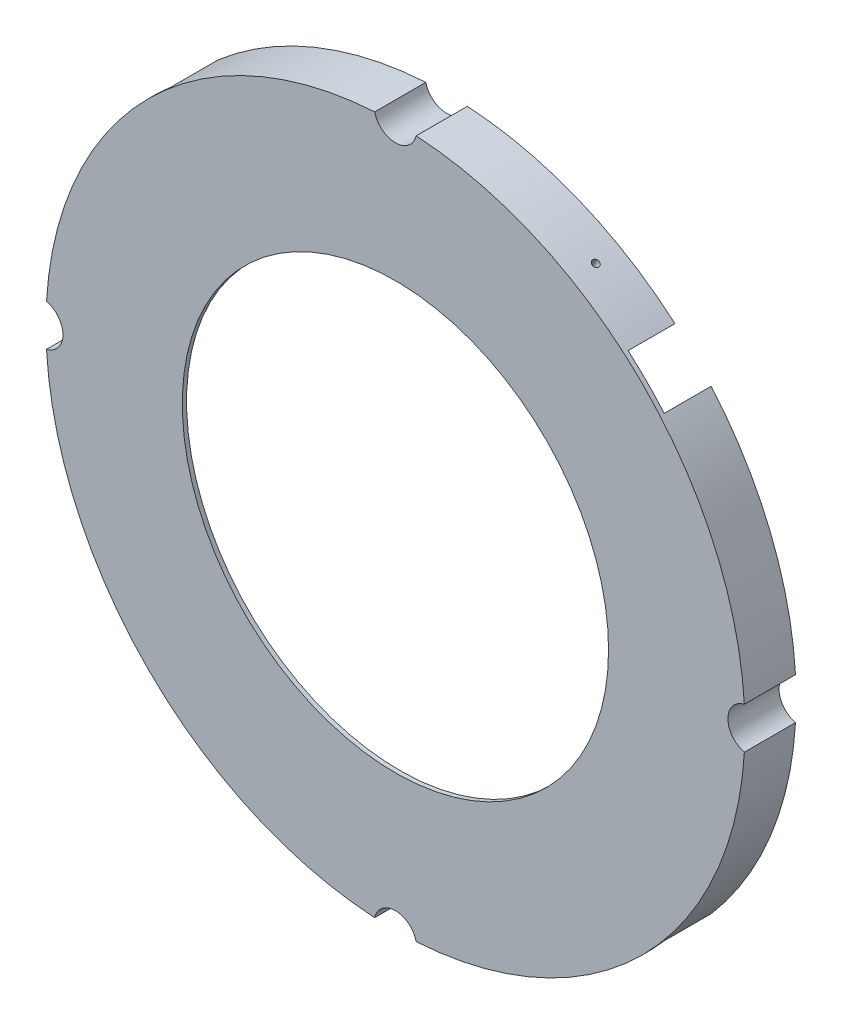
ISO-10303-21;
HEADER;
FILE_DESCRIPTION(('STEP AP214'),'2;1');
FILE_NAME('part.step','',(''),(''),'','','');
FILE_SCHEMA(('AUTOMOTIVE_DESIGN { 1 0 10303 214 1 1 1 1 }'));
ENDSEC;
DATA;
#1=APPLICATION_CONTEXT('core data for automotive mechanical design processes');
#2=APPLICATION_PROTOCOL_DEFINITION('international standard','automotive_design',2000,#1);
#3=PRODUCT_CONTEXT('',#1,'mechanical');
#4=PRODUCT('Part','Part','',(#3));
#5=PRODUCT_RELATED_PRODUCT_CATEGORY('part','',(#4));
#6=PRODUCT_DEFINITION_FORMATION('','',#4);
#7=PRODUCT_DEFINITION_CONTEXT('part definition',#1,'design');
#8=PRODUCT_DEFINITION('design','',#6,#7);
#9=PRODUCT_DEFINITION_SHAPE('','',#8);
#10=(LENGTH_UNIT() NAMED_UNIT(*) SI_UNIT(.MILLI.,.METRE.));
#11=(NAMED_UNIT(*) PLANE_ANGLE_UNIT() SI_UNIT($,.RADIAN.));
#12=(NAMED_UNIT(*) SI_UNIT($,.STERADIAN.) SOLID_ANGLE_UNIT());
#13=UNCERTAINTY_MEASURE_WITH_UNIT(LENGTH_MEASURE(1.E-05),#10,'distance_accuracy_value','');
#14=(GEOMETRIC_REPRESENTATION_CONTEXT(3) GLOBAL_UNCERTAINTY_ASSIGNED_CONTEXT((#13)) GLOBAL_UNIT_ASSIGNED_CONTEXT((#10,
#11,#12)) REPRESENTATION_CONTEXT('',''));
#15=CARTESIAN_POINT('',(0.,0.,0.));
#16=DIRECTION('',(0.,0.,1.));
#17=DIRECTION('',(1.,0.,0.));
#18=AXIS2_PLACEMENT_3D('',#15,#16,#17);
#19=CARTESIAN_POINT('',(0.,0.,-11.));
#20=DIRECTION('',(0.,0.,-1.));
#21=DIRECTION('',(-1.,0.,0.));
#22=AXIS2_PLACEMENT_3D('',#19,#20,#21);
#23=PLANE('',#22);
#24=DIRECTION('',(-0.707106781186541,-0.707106781186554,0.));
#25=VECTOR('',#24,1.);
#26=CARTESIAN_POINT('',(46.5515949457876,38.06631357155,-11.));
#27=LINE('',#26,#25);
#28=CARTESIAN_POINT('',(62.0699698663226,53.5846884920852,-11.));
#29=VERTEX_POINT('',#28);
#30=CARTESIAN_POINT('',(57.1056712472371,48.6203898729996,-11.));
#31=VERTEX_POINT('',#30);
#32=EDGE_CURVE('E368',#29,#31,#27,.T.);
#33=ORIENTED_EDGE('',*,*,#32,.F.);
#34=CARTESIAN_POINT('',(0.,0.,-11.));
#35=DIRECTION('',(0.,0.,-1.));
#36=DIRECTION('',(-1.,0.,0.));
#37=AXIS2_PLACEMENT_3D('',#34,#35,#36);
#38=CIRCLE('',#37,82.);
#39=CARTESIAN_POINT('',(81.855421686747,4.8672312955959,-11.));
#40=VERTEX_POINT('',#39);
#41=EDGE_CURVE('E336',#29,#40,#38,.T.);
#42=ORIENTED_EDGE('',*,*,#41,.T.);
#43=CARTESIAN_POINT('',(83.,-2.8979295112398E-13,-11.));
#44=DIRECTION('',(0.,0.,1.));
#45=DIRECTION('',(0.,-1.,0.));
#46=AXIS2_PLACEMENT_3D('',#43,#44,#45);
#47=CIRCLE('',#46,5.);
#48=CARTESIAN_POINT('',(81.855421686747,-4.86723129559648,-11.));
#49=VERTEX_POINT('',#48);
#50=EDGE_CURVE('E302',#40,#49,#47,.T.);
#51=ORIENTED_EDGE('',*,*,#50,.T.);
#52=CARTESIAN_POINT('',(62.0699698663231,-53.5846884920846,-11.));
#53=VERTEX_POINT('',#52);
#54=EDGE_CURVE('E337',#49,#53,#38,.T.);
#55=ORIENTED_EDGE('',*,*,#54,.T.);
#56=DIRECTION('',(0.707106781186547,-0.707106781186547,0.));
#57=VECTOR('',#56,1.);
#58=CARTESIAN_POINT('',(67.8822509939086,-59.39696961967,-11.));
#59=LINE('',#58,#57);
#60=CARTESIAN_POINT('',(57.1056712472376,-48.620389872999,-11.));
#61=VERTEX_POINT('',#60);
#62=EDGE_CURVE('E222',#61,#53,#59,.T.);
#63=ORIENTED_EDGE('',*,*,#62,.F.);
#64=CARTESIAN_POINT('',(0.,0.,-11.));
#65=DIRECTION('',(0.,0.,-1.));
#66=DIRECTION('',(-1.,0.,0.));
#67=AXIS2_PLACEMENT_3D('',#64,#65,#66);
#68=CIRCLE('',#67,75.);
#69=EDGE_CURVE('E330',#31,#61,#68,.T.);
#70=ORIENTED_EDGE('',*,*,#69,.F.);
#71=EDGE_LOOP('',(#33,#42,#51,#55,#63,#70));
#72=FACE_BOUND('',#71,.T.);
#73=ADVANCED_FACE('F33',(#72),#23,.T.);
#74=CARTESIAN_POINT('',(0.,0.,-11.));
#75=DIRECTION('',(0.,0.,1.));
#76=DIRECTION('',(1.,0.,0.));
#77=AXIS2_PLACEMENT_3D('',#74,#75,#76);
#78=CYLINDRICAL_SURFACE('',#77,75.);
#79=DIRECTION('',(0.,0.,1.));
#80=VECTOR('',#79,1.);
#81=CARTESIAN_POINT('',(57.1056712472371,48.6203898729996,-11.));
#82=LINE('',#81,#80);
#83=CARTESIAN_POINT('',(57.1056712472371,48.6203898729996,0.));
#84=VERTEX_POINT('',#83);
#85=EDGE_CURVE('E45',#31,#84,#82,.T.);
#86=ORIENTED_EDGE('',*,*,#85,.F.);
#87=ORIENTED_EDGE('',*,*,#69,.T.);
#88=DIRECTION('',(0.,0.,1.));
#89=VECTOR('',#88,1.);
#90=CARTESIAN_POINT('',(57.1056712472376,-48.620389872999,-11.));
#91=LINE('',#90,#89);
#92=CARTESIAN_POINT('',(57.1056712472376,-48.620389872999,0.));
#93=VERTEX_POINT('',#92);
#94=EDGE_CURVE('E358',#93,#61,#91,.F.);
#95=ORIENTED_EDGE('',*,*,#94,.F.);
#96=CARTESIAN_POINT('',(0.,0.,0.));
#97=DIRECTION('',(0.,0.,-1.));
#98=DIRECTION('',(-1.,0.,0.));
#99=AXIS2_PLACEMENT_3D('',#96,#97,#98);
#100=CIRCLE('',#99,75.);
#101=EDGE_CURVE('E60',#84,#93,#100,.T.);
#102=ORIENTED_EDGE('',*,*,#101,.F.);
#103=EDGE_LOOP('',(#86,#87,#95,#102));
#104=FACE_BOUND('',#103,.T.);
#105=ADVANCED_FACE('F373',(#104),#78,.F.);
#106=DIRECTION('',(-0.707106781186546,0.707106781186549,0.));
#107=VECTOR('',#106,1.);
#108=CARTESIAN_POINT('',(38.0663135715495,-46.551594945788,-11.));
#109=LINE('',#108,#107);
#110=CARTESIAN_POINT('',(53.5846884920845,-62.0699698663232,-11.));
#111=VERTEX_POINT('',#110);
#112=CARTESIAN_POINT('',(48.620389872999,-57.1056712472376,-11.));
#113=VERTEX_POINT('',#112);
#114=EDGE_CURVE('E220',#111,#113,#109,.T.);
#115=ORIENTED_EDGE('',*,*,#114,.F.);
#116=CARTESIAN_POINT('',(4.86723129559619,-81.855421686747,-11.));
#117=VERTEX_POINT('',#116);
#118=EDGE_CURVE('E403',#111,#117,#38,.T.);
#119=ORIENTED_EDGE('',*,*,#118,.T.);
#120=CARTESIAN_POINT('',(0.,-83.,-11.));
#121=DIRECTION('',(0.,0.,1.));
#122=DIRECTION('',(-1.,0.,0.));
#123=AXIS2_PLACEMENT_3D('',#120,#121,#122);
#124=CIRCLE('',#123,5.);
#125=CARTESIAN_POINT('',(-4.86723129559619,-81.855421686747,-11.));
#126=VERTEX_POINT('',#125);
#127=EDGE_CURVE('E290',#117,#126,#124,.T.);
#128=ORIENTED_EDGE('',*,*,#127,.T.);
#129=CARTESIAN_POINT('',(-53.5846884920843,-62.0699698663233,-11.));
#130=VERTEX_POINT('',#129);
#131=EDGE_CURVE('E404',#126,#130,#38,.T.);
#132=ORIENTED_EDGE('',*,*,#131,.T.);
#133=DIRECTION('',(-0.707106781186545,-0.70710678118655,0.));
#134=VECTOR('',#133,1.);
#135=CARTESIAN_POINT('',(-59.3969696196698,-67.8822509939088,-11.));
#136=LINE('',#135,#134);
#137=CARTESIAN_POINT('',(-48.6203898729988,-57.1056712472378,-11.));
#138=VERTEX_POINT('',#137);
#139=EDGE_CURVE('E242',#138,#130,#136,.T.);
#140=ORIENTED_EDGE('',*,*,#139,.F.);
#141=EDGE_CURVE('E390',#113,#138,#68,.T.);
#142=ORIENTED_EDGE('',*,*,#141,.F.);
#143=EDGE_LOOP('',(#115,#119,#128,#132,#140,#142));
#144=FACE_BOUND('',#143,.T.);
#145=ADVANCED_FACE('F453',(#144),#23,.T.);
#146=DIRECTION('',(0.,0.,1.));
#147=VECTOR('',#146,1.);
#148=CARTESIAN_POINT('',(48.620389872999,-57.1056712472376,-11.));
#149=LINE('',#148,#147);
#150=CARTESIAN_POINT('',(48.620389872999,-57.1056712472376,0.));
#151=VERTEX_POINT('',#150);
#152=EDGE_CURVE('E361',#113,#151,#149,.T.);
#153=ORIENTED_EDGE('',*,*,#152,.F.);
#154=ORIENTED_EDGE('',*,*,#141,.T.);
#155=DIRECTION('',(0.,0.,1.));
#156=VECTOR('',#155,1.);
#157=CARTESIAN_POINT('',(-48.6203898729988,-57.1056712472378,-11.));
#158=LINE('',#157,#156);
#159=CARTESIAN_POINT('',(-48.6203898729988,-57.1056712472378,0.));
#160=VERTEX_POINT('',#159);
#161=EDGE_CURVE('E353',#160,#138,#158,.F.);
#162=ORIENTED_EDGE('',*,*,#161,.F.);
#163=EDGE_CURVE('E374',#151,#160,#100,.T.);
#164=ORIENTED_EDGE('',*,*,#163,.F.);
#165=EDGE_LOOP('',(#153,#154,#162,#164));
#166=FACE_BOUND('',#165,.T.);
#167=ADVANCED_FACE('F458',(#166),#78,.F.);
#168=DIRECTION('',(0.707106781186546,0.707106781186549,0.));
#169=VECTOR('',#168,1.);
#170=CARTESIAN_POINT('',(-46.5515949457879,-38.0663135715496,-11.));
#171=LINE('',#170,#169);
#172=CARTESIAN_POINT('',(-62.069969866323,-53.5846884920848,-11.));
#173=VERTEX_POINT('',#172);
#174=CARTESIAN_POINT('',(-57.1056712472374,-48.6203898729992,-11.));
#175=VERTEX_POINT('',#174);
#176=EDGE_CURVE('E241',#173,#175,#171,.T.);
#177=ORIENTED_EDGE('',*,*,#176,.F.);
#178=CARTESIAN_POINT('',(-81.8554216867471,-4.86723129559533,-11.));
#179=VERTEX_POINT('',#178);
#180=EDGE_CURVE('E405',#173,#179,#38,.T.);
#181=ORIENTED_EDGE('',*,*,#180,.T.);
#182=CARTESIAN_POINT('',(-83.,8.6937885337194E-13,-11.));
#183=DIRECTION('',(0.,0.,1.));
#184=DIRECTION('',(0.,1.,0.));
#185=AXIS2_PLACEMENT_3D('',#182,#183,#184);
#186=CIRCLE('',#185,5.);
#187=CARTESIAN_POINT('',(-81.8554216867469,4.86723129559705,-11.));
#188=VERTEX_POINT('',#187);
#189=EDGE_CURVE('E279',#179,#188,#186,.T.);
#190=ORIENTED_EDGE('',*,*,#189,.T.);
#191=CARTESIAN_POINT('',(-62.0699698663231,53.5846884920846,-11.));
#192=VERTEX_POINT('',#191);
#193=EDGE_CURVE('E407',#188,#192,#38,.T.);
#194=ORIENTED_EDGE('',*,*,#193,.T.);
#195=DIRECTION('',(-0.707106781186547,0.707106781186547,0.));
#196=VECTOR('',#195,1.);
#197=CARTESIAN_POINT('',(-67.8822509939086,59.39696961967,-11.));
#198=LINE('',#197,#196);
#199=CARTESIAN_POINT('',(-57.1056712472376,48.620389872999,-11.));
#200=VERTEX_POINT('',#199);
#201=EDGE_CURVE('E261',#200,#192,#198,.T.);
#202=ORIENTED_EDGE('',*,*,#201,.F.);
#203=EDGE_CURVE('E331',#175,#200,#68,.T.);
#204=ORIENTED_EDGE('',*,*,#203,.F.);
#205=EDGE_LOOP('',(#177,#181,#190,#194,#202,#204));
#206=FACE_BOUND('',#205,.T.);
#207=ADVANCED_FACE('F461',(#206),#23,.T.);
#208=DIRECTION('',(0.,0.,1.));
#209=VECTOR('',#208,1.);
#210=CARTESIAN_POINT('',(-57.1056712472374,-48.6203898729992,-11.));
#211=LINE('',#210,#209);
#212=CARTESIAN_POINT('',(-57.1056712472374,-48.6203898729992,0.));
#213=VERTEX_POINT('',#212);
#214=EDGE_CURVE('E356',#175,#213,#211,.T.);
#215=ORIENTED_EDGE('',*,*,#214,.F.);
#216=ORIENTED_EDGE('',*,*,#203,.T.);
#217=DIRECTION('',(0.,0.,1.));
#218=VECTOR('',#217,1.);
#219=CARTESIAN_POINT('',(-57.1056712472376,48.620389872999,-11.));
#220=LINE('',#219,#218);
#221=CARTESIAN_POINT('',(-57.1056712472376,48.620389872999,0.));
#222=VERTEX_POINT('',#221);
#223=EDGE_CURVE('E347',#222,#200,#220,.F.);
#224=ORIENTED_EDGE('',*,*,#223,.F.);
#225=EDGE_CURVE('E325',#213,#222,#100,.T.);
#226=ORIENTED_EDGE('',*,*,#225,.F.);
#227=EDGE_LOOP('',(#215,#216,#224,#226));
#228=FACE_BOUND('',#227,.T.);
#229=ADVANCED_FACE('F386',(#228),#78,.F.);
#230=CARTESIAN_POINT('',(0.,0.,1.));
#231=DIRECTION('',(0.,0.,-1.));
#232=DIRECTION('',(-1.,0.,0.));
#233=AXIS2_PLACEMENT_3D('',#230,#231,#232);
#234=CYLINDRICAL_SURFACE('',#233,82.);
#235=CARTESIAN_POINT('',(-53.5846884920845,62.0699698663232,-11.));
#236=VERTEX_POINT('',#235);
#237=CARTESIAN_POINT('',(-4.86723129559619,81.855421686747,-11.));
#238=VERTEX_POINT('',#237);
#239=EDGE_CURVE('E329',#236,#238,#38,.T.);
#240=ORIENTED_EDGE('',*,*,#239,.F.);
#241=DIRECTION('',(0.,0.,-1.));
#242=VECTOR('',#241,1.);
#243=CARTESIAN_POINT('',(-53.5846884920845,62.0699698663231,1.));
#244=LINE('',#243,#242);
#245=CARTESIAN_POINT('',(-53.5846884920845,62.0699698663232,0.));
#246=VERTEX_POINT('',#245);
#247=EDGE_CURVE('E272',#236,#246,#244,.F.);
#248=ORIENTED_EDGE('',*,*,#247,.T.);
#249=CARTESIAN_POINT('',(0.,0.,0.));
#250=DIRECTION('',(0.,0.,1.));
#251=DIRECTION('',(1.,0.,0.));
#252=AXIS2_PLACEMENT_3D('',#249,#250,#251);
#253=CIRCLE('',#252,82.);
#254=CARTESIAN_POINT('',(-62.0699698663231,53.5846884920846,0.));
#255=VERTEX_POINT('',#254);
#256=EDGE_CURVE('E275',#246,#255,#253,.T.);
#257=ORIENTED_EDGE('',*,*,#256,.T.);
#258=DIRECTION('',(0.,0.,-1.));
#259=VECTOR('',#258,1.);
#260=CARTESIAN_POINT('',(-62.0699698663231,53.5846884920846,1.));
#261=LINE('',#260,#259);
#262=EDGE_CURVE('E269',#255,#192,#261,.T.);
#263=ORIENTED_EDGE('',*,*,#262,.T.);
#264=ORIENTED_EDGE('',*,*,#193,.F.);
#265=DIRECTION('',(0.,0.,1.));
#266=VECTOR('',#265,1.);
#267=CARTESIAN_POINT('',(-81.8554216867469,4.86723129559704,-5.));
#268=LINE('',#267,#266);
#269=CARTESIAN_POINT('',(-81.8554216867469,4.86723129559704,1.));
#270=VERTEX_POINT('',#269);
#271=EDGE_CURVE('E286',#188,#270,#268,.T.);
#272=ORIENTED_EDGE('',*,*,#271,.T.);
#273=CARTESIAN_POINT('',(0.,0.,1.));
#274=DIRECTION('',(0.,0.,1.));
#275=DIRECTION('',(1.,0.,0.));
#276=AXIS2_PLACEMENT_3D('',#273,#274,#275);
#277=CIRCLE('',#276,82.);
#278=CARTESIAN_POINT('',(-4.86723129559619,81.855421686747,1.));
#279=VERTEX_POINT('',#278);
#280=EDGE_CURVE('E344',#279,#270,#277,.T.);
#281=ORIENTED_EDGE('',*,*,#280,.F.);
#282=DIRECTION('',(0.,0.,1.));
#283=VECTOR('',#282,1.);
#284=CARTESIAN_POINT('',(-4.86723129559619,81.855421686747,-5.));
#285=LINE('',#284,#283);
#286=EDGE_CURVE('E317',#279,#238,#285,.F.);
#287=ORIENTED_EDGE('',*,*,#286,.T.);
#288=EDGE_LOOP('',(#240,#248,#257,#263,#264,#272,#281,#287));
#289=FACE_BOUND('',#288,.T.);
#290=ADVANCED_FACE('F424',(#289),#234,.T.);
#291=ORIENTED_EDGE('',*,*,#180,.F.);
#292=DIRECTION('',(0.,0.,-1.));
#293=VECTOR('',#292,1.);
#294=CARTESIAN_POINT('',(-62.069969866323,-53.5846884920848,1.));
#295=LINE('',#294,#293);
#296=CARTESIAN_POINT('',(-62.069969866323,-53.5846884920848,0.));
#297=VERTEX_POINT('',#296);
#298=EDGE_CURVE('E254',#173,#297,#295,.F.);
#299=ORIENTED_EDGE('',*,*,#298,.T.);
#300=CARTESIAN_POINT('',(0.,0.,0.));
#301=DIRECTION('',(0.,0.,1.));
#302=DIRECTION('',(1.,0.,0.));
#303=AXIS2_PLACEMENT_3D('',#300,#301,#302);
#304=CIRCLE('',#303,82.);
#305=CARTESIAN_POINT('',(-53.5846884920843,-62.0699698663233,0.));
#306=VERTEX_POINT('',#305);
#307=EDGE_CURVE('E257',#297,#306,#304,.T.);
#308=ORIENTED_EDGE('',*,*,#307,.T.);
#309=DIRECTION('',(0.,0.,-1.));
#310=VECTOR('',#309,1.);
#311=CARTESIAN_POINT('',(-53.5846884920843,-62.0699698663233,1.));
#312=LINE('',#311,#310);
#313=EDGE_CURVE('E251',#306,#130,#312,.T.);
#314=ORIENTED_EDGE('',*,*,#313,.T.);
#315=ORIENTED_EDGE('',*,*,#131,.F.);
#316=DIRECTION('',(0.,0.,1.));
#317=VECTOR('',#316,1.);
#318=CARTESIAN_POINT('',(-4.86723129559619,-81.855421686747,-5.));
#319=LINE('',#318,#317);
#320=CARTESIAN_POINT('',(-4.86723129559619,-81.855421686747,1.));
#321=VERTEX_POINT('',#320);
#322=EDGE_CURVE('E298',#126,#321,#319,.T.);
#323=ORIENTED_EDGE('',*,*,#322,.T.);
#324=CARTESIAN_POINT('',(-81.8554216867471,-4.86723129559533,1.));
#325=VERTEX_POINT('',#324);
#326=EDGE_CURVE('E348',#325,#321,#277,.T.);
#327=ORIENTED_EDGE('',*,*,#326,.F.);
#328=DIRECTION('',(0.,0.,1.));
#329=VECTOR('',#328,1.);
#330=CARTESIAN_POINT('',(-81.8554216867471,-4.86723129559533,-5.));
#331=LINE('',#330,#329);
#332=EDGE_CURVE('E282',#325,#179,#331,.F.);
#333=ORIENTED_EDGE('',*,*,#332,.T.);
#334=EDGE_LOOP('',(#291,#299,#308,#314,#315,#323,#327,#333));
#335=FACE_BOUND('',#334,.T.);
#336=ADVANCED_FACE('F480',(#335),#234,.T.);
#337=ORIENTED_EDGE('',*,*,#118,.F.);
#338=DIRECTION('',(0.,0.,-1.));
#339=VECTOR('',#338,1.);
#340=CARTESIAN_POINT('',(53.5846884920845,-62.0699698663231,1.));
#341=LINE('',#340,#339);
#342=CARTESIAN_POINT('',(53.5846884920845,-62.0699698663232,0.));
#343=VERTEX_POINT('',#342);
#344=EDGE_CURVE('E235',#111,#343,#341,.F.);
#345=ORIENTED_EDGE('',*,*,#344,.T.);
#346=CARTESIAN_POINT('',(0.,0.,0.));
#347=DIRECTION('',(0.,0.,1.));
#348=DIRECTION('',(1.,0.,0.));
#349=AXIS2_PLACEMENT_3D('',#346,#347,#348);
#350=CIRCLE('',#349,82.);
#351=CARTESIAN_POINT('',(62.0699698663231,-53.5846884920846,0.));
#352=VERTEX_POINT('',#351);
#353=EDGE_CURVE('E238',#343,#352,#350,.T.);
#354=ORIENTED_EDGE('',*,*,#353,.T.);
#355=DIRECTION('',(0.,0.,-1.));
#356=VECTOR('',#355,1.);
#357=CARTESIAN_POINT('',(62.0699698663231,-53.5846884920846,1.));
#358=LINE('',#357,#356);
#359=EDGE_CURVE('E232',#352,#53,#358,.T.);
#360=ORIENTED_EDGE('',*,*,#359,.T.);
#361=ORIENTED_EDGE('',*,*,#54,.F.);
#362=DIRECTION('',(0.,0.,1.));
#363=VECTOR('',#362,1.);
#364=CARTESIAN_POINT('',(81.855421686747,-4.86723129559647,-5.));
#365=LINE('',#364,#363);
#366=CARTESIAN_POINT('',(81.855421686747,-4.86723129559647,1.));
#367=VERTEX_POINT('',#366);
#368=EDGE_CURVE('E310',#49,#367,#365,.T.);
#369=ORIENTED_EDGE('',*,*,#368,.T.);
#370=CARTESIAN_POINT('',(4.86723129559619,-81.855421686747,1.));
#371=VERTEX_POINT('',#370);
#372=EDGE_CURVE('E482',#371,#367,#277,.T.);
#373=ORIENTED_EDGE('',*,*,#372,.F.);
#374=DIRECTION('',(0.,0.,1.));
#375=VECTOR('',#374,1.);
#376=CARTESIAN_POINT('',(4.86723129559619,-81.855421686747,-5.));
#377=LINE('',#376,#375);
#378=EDGE_CURVE('E293',#371,#117,#377,.F.);
#379=ORIENTED_EDGE('',*,*,#378,.T.);
#380=EDGE_LOOP('',(#337,#345,#354,#360,#361,#369,#373,#379));
#381=FACE_BOUND('',#380,.T.);
#382=ADVANCED_FACE('F487',(#381),#234,.T.);
#383=CARTESIAN_POINT('',(0.,0.,1.));
#384=DIRECTION('',(0.,0.,1.));
#385=DIRECTION('',(1.,0.,0.));
#386=AXIS2_PLACEMENT_3D('',#383,#384,#385);
#387=PLANE('',#386);
#388=CARTESIAN_POINT('',(-83.,8.6937885337194E-13,1.));
#389=DIRECTION('',(0.,0.,1.));
#390=DIRECTION('',(0.,1.,0.));
#391=AXIS2_PLACEMENT_3D('',#388,#389,#390);
#392=CIRCLE('',#391,5.);
#393=EDGE_CURVE('E278',#325,#270,#392,.T.);
#394=ORIENTED_EDGE('',*,*,#393,.F.);
#395=ORIENTED_EDGE('',*,*,#326,.T.);
#396=CARTESIAN_POINT('',(0.,-83.,1.));
#397=DIRECTION('',(0.,0.,1.));
#398=DIRECTION('',(-1.,0.,0.));
#399=AXIS2_PLACEMENT_3D('',#396,#397,#398);
#400=CIRCLE('',#399,5.);
#401=EDGE_CURVE('E289',#371,#321,#400,.T.);
#402=ORIENTED_EDGE('',*,*,#401,.F.);
#403=ORIENTED_EDGE('',*,*,#372,.T.);
#404=CARTESIAN_POINT('',(83.,-2.8979295112398E-13,1.));
#405=DIRECTION('',(0.,0.,1.));
#406=DIRECTION('',(0.,-1.,0.));
#407=AXIS2_PLACEMENT_3D('',#404,#405,#406);
#408=CIRCLE('',#407,5.);
#409=CARTESIAN_POINT('',(81.855421686747,4.8672312955959,1.));
#410=VERTEX_POINT('',#409);
#411=EDGE_CURVE('E301',#410,#367,#408,.T.);
#412=ORIENTED_EDGE('',*,*,#411,.F.);
#413=CARTESIAN_POINT('',(4.86723129559619,81.855421686747,1.));
#414=VERTEX_POINT('',#413);
#415=EDGE_CURVE('E341',#410,#414,#277,.T.);
#416=ORIENTED_EDGE('',*,*,#415,.T.);
#417=CARTESIAN_POINT('',(0.,83.,1.));
#418=DIRECTION('',(0.,0.,1.));
#419=DIRECTION('',(1.,0.,0.));
#420=AXIS2_PLACEMENT_3D('',#417,#418,#419);
#421=CIRCLE('',#420,5.);
#422=EDGE_CURVE('E313',#279,#414,#421,.T.);
#423=ORIENTED_EDGE('',*,*,#422,.F.);
#424=ORIENTED_EDGE('',*,*,#280,.T.);
#425=EDGE_LOOP('',(#394,#395,#402,#403,#412,#416,#423,#424));
#426=FACE_BOUND('',#425,.T.);
#427=CARTESIAN_POINT('',(0.,0.,1.));
#428=DIRECTION('',(0.,0.,1.));
#429=DIRECTION('',(1.,0.,0.));
#430=AXIS2_PLACEMENT_3D('',#427,#428,#429);
#431=CIRCLE('',#430,50.);
#432=CARTESIAN_POINT('',(50.,0.,1.));
#433=VERTEX_POINT('',#432);
#434=EDGE_CURVE('E338',#433,#433,#431,.T.);
#435=ORIENTED_EDGE('',*,*,#434,.F.);
#436=EDGE_LOOP('',(#435));
#437=FACE_BOUND('',#436,.T.);
#438=ADVANCED_FACE('F427',(#426,#437),#387,.T.);
#439=CARTESIAN_POINT('',(0.,0.,0.));
#440=DIRECTION('',(0.,0.,1.));
#441=DIRECTION('',(1.,0.,0.));
#442=AXIS2_PLACEMENT_3D('',#439,#440,#441);
#443=PLANE('',#442);
#444=DIRECTION('',(-0.707106781186541,-0.707106781186554,0.));
#445=VECTOR('',#444,1.);
#446=CARTESIAN_POINT('',(46.5515949457876,38.06631357155,0.));
#447=LINE('',#446,#445);
#448=CARTESIAN_POINT('',(62.0699698663226,53.5846884920852,0.));
#449=VERTEX_POINT('',#448);
#450=EDGE_CURVE('E216',#449,#84,#447,.T.);
#451=ORIENTED_EDGE('',*,*,#450,.T.);
#452=ORIENTED_EDGE('',*,*,#101,.T.);
#453=DIRECTION('',(0.707106781186548,-0.707106781186548,0.));
#454=VECTOR('',#453,1.);
#455=CARTESIAN_POINT('',(67.8822509939086,-59.39696961967,0.));
#456=LINE('',#455,#454);
#457=EDGE_CURVE('E230',#93,#352,#456,.T.);
#458=ORIENTED_EDGE('',*,*,#457,.T.);
#459=ORIENTED_EDGE('',*,*,#353,.F.);
#460=DIRECTION('',(-0.707106781186546,0.707106781186549,0.));
#461=VECTOR('',#460,1.);
#462=CARTESIAN_POINT('',(38.0663135715495,-46.551594945788,0.));
#463=LINE('',#462,#461);
#464=EDGE_CURVE('E226',#343,#151,#463,.T.);
#465=ORIENTED_EDGE('',*,*,#464,.T.);
#466=ORIENTED_EDGE('',*,*,#163,.T.);
#467=DIRECTION('',(-0.707106781186545,-0.70710678118655,0.));
#468=VECTOR('',#467,1.);
#469=CARTESIAN_POINT('',(-59.3969696196698,-67.8822509939088,0.));
#470=LINE('',#469,#468);
#471=EDGE_CURVE('E248',#160,#306,#470,.T.);
#472=ORIENTED_EDGE('',*,*,#471,.T.);
#473=ORIENTED_EDGE('',*,*,#307,.F.);
#474=DIRECTION('',(0.707106781186546,0.707106781186549,0.));
#475=VECTOR('',#474,1.);
#476=CARTESIAN_POINT('',(-46.5515949457879,-38.0663135715496,0.));
#477=LINE('',#476,#475);
#478=EDGE_CURVE('E244',#297,#213,#477,.T.);
#479=ORIENTED_EDGE('',*,*,#478,.T.);
#480=ORIENTED_EDGE('',*,*,#225,.T.);
#481=DIRECTION('',(-0.707106781186548,0.707106781186548,0.));
#482=VECTOR('',#481,1.);
#483=CARTESIAN_POINT('',(-67.8822509939086,59.39696961967,0.));
#484=LINE('',#483,#482);
#485=EDGE_CURVE('E266',#222,#255,#484,.T.);
#486=ORIENTED_EDGE('',*,*,#485,.T.);
#487=ORIENTED_EDGE('',*,*,#256,.F.);
#488=DIRECTION('',(0.707106781186546,-0.707106781186549,0.));
#489=VECTOR('',#488,1.);
#490=CARTESIAN_POINT('',(-38.0663135715495,46.551594945788,0.));
#491=LINE('',#490,#489);
#492=CARTESIAN_POINT('',(-48.620389872999,57.1056712472376,0.));
#493=VERTEX_POINT('',#492);
#494=EDGE_CURVE('E263',#246,#493,#491,.T.);
#495=ORIENTED_EDGE('',*,*,#494,.T.);
#496=CARTESIAN_POINT('',(48.6203898729984,57.1056712472381,0.));
#497=VERTEX_POINT('',#496);
#498=EDGE_CURVE('E215',#493,#497,#100,.T.);
#499=ORIENTED_EDGE('',*,*,#498,.T.);
#500=DIRECTION('',(0.70710678118654,0.707106781186555,0.));
#501=VECTOR('',#500,1.);
#502=CARTESIAN_POINT('',(59.3969696196693,67.8822509939092,0.));
#503=LINE('',#502,#501);
#504=CARTESIAN_POINT('',(53.5846884920839,62.0699698663237,0.));
#505=VERTEX_POINT('',#504);
#506=EDGE_CURVE('E52',#497,#505,#503,.T.);
#507=ORIENTED_EDGE('',*,*,#506,.T.);
#508=CARTESIAN_POINT('',(0.,0.,0.));
#509=DIRECTION('',(0.,0.,1.));
#510=DIRECTION('',(1.,0.,0.));
#511=AXIS2_PLACEMENT_3D('',#508,#509,#510);
#512=CIRCLE('',#511,82.);
#513=EDGE_CURVE('E211',#449,#505,#512,.T.);
#514=ORIENTED_EDGE('',*,*,#513,.F.);
#515=EDGE_LOOP('',(#451,#452,#458,#459,#465,#466,#472,#473,#479,#480,#486,#487,#495,#499,#507,#514));
#516=FACE_BOUND('',#515,.T.);
#517=CARTESIAN_POINT('',(0.,0.,0.));
#518=DIRECTION('',(0.,0.,1.));
#519=DIRECTION('',(1.,0.,0.));
#520=AXIS2_PLACEMENT_3D('',#517,#518,#519);
#521=CIRCLE('',#520,50.);
#522=CARTESIAN_POINT('',(50.,0.,0.));
#523=VERTEX_POINT('',#522);
#524=EDGE_CURVE('E335',#523,#523,#521,.T.);
#525=ORIENTED_EDGE('',*,*,#524,.T.);
#526=EDGE_LOOP('',(#525));
#527=FACE_BOUND('',#526,.T.);
#528=ADVANCED_FACE('F209',(#516,#527),#443,.F.);
#529=CARTESIAN_POINT('',(40.3052284115924,71.4107034182507,-5.));
#530=CARTESIAN_POINT('',(40.3052301633493,71.4107024678047,-5.04493520390699));
#531=CARTESIAN_POINT('',(40.3085368084434,71.4088364246115,-5.08990296285125));
#532=CARTESIAN_POINT('',(40.3216802141559,71.4014156685153,-5.17859996649442));
#533=CARTESIAN_POINT('',(40.3315248284543,71.3958565192976,-5.2223276556179));
#534=CARTESIAN_POINT('',(40.3574592533225,71.3811999283402,-5.30724669231037));
#535=CARTESIAN_POINT('',(40.3735460732806,71.3721041809638,-5.34843924351921));
#536=CARTESIAN_POINT('',(40.4114971305405,71.3506227918564,-5.42712570916521));
#537=CARTESIAN_POINT('',(40.4333599340125,71.3382379666016,-5.46462053835673));
#538=CARTESIAN_POINT('',(40.4822388615059,71.3105120158714,-5.53486556458639));
#539=CARTESIAN_POINT('',(40.5092556775978,71.2951704933736,-5.56761512339878));
#540=CARTESIAN_POINT('',(40.5676657220308,71.2619507470621,-5.62743482951291));
#541=CARTESIAN_POINT('',(40.599059122413,71.2440724235275,-5.65450475344643));
#542=CARTESIAN_POINT('',(40.6653214685316,71.2062713709685,-5.70219528307291));
#543=CARTESIAN_POINT('',(40.7001904187869,71.1863486392859,-5.72281588038009));
#544=CARTESIAN_POINT('',(40.7724063353072,71.1450111453561,-5.75702220212478));
#545=CARTESIAN_POINT('',(40.8097532960657,71.1235963864243,-5.77060794219386));
#546=CARTESIAN_POINT('',(40.8858585327661,71.079874063185,-5.79035855621549));
#547=CARTESIAN_POINT('',(40.9246167658102,71.0575665260127,-5.79652365553588));
#548=CARTESIAN_POINT('',(41.0024427082084,71.0126869612696,-5.80125866440196));
#549=CARTESIAN_POINT('',(41.041510416933,70.9901149342366,-5.79982858939186));
#550=CARTESIAN_POINT('',(41.1188455723009,70.9453489348131,-5.78941407368628));
#551=CARTESIAN_POINT('',(41.1571130458588,70.9231549497125,-5.78042988748108));
#552=CARTESIAN_POINT('',(41.2317665372485,70.8797805665896,-5.7551625649418));
#553=CARTESIAN_POINT('',(41.2681525528658,70.8586001697603,-5.73887942001684));
#554=CARTESIAN_POINT('',(41.3380172200317,70.8178647616153,-5.69947611790389));
#555=CARTESIAN_POINT('',(41.3714958221777,70.7983097779187,-5.67635584456898));
#556=CARTESIAN_POINT('',(41.4346030172831,70.7613949229265,-5.62393469651526));
#557=CARTESIAN_POINT('',(41.4642316107053,70.7440350513672,-5.59463382253917));
#558=CARTESIAN_POINT('',(41.5188083012965,70.7120185022483,-5.53068177180891));
#559=CARTESIAN_POINT('',(41.5437562027562,70.69736193772,-5.4960303714487));
#560=CARTESIAN_POINT('',(41.5882710518441,70.6711849337197,-5.42236170264746));
#561=CARTESIAN_POINT('',(41.6078379987539,70.6596644946664,-5.38334443362357));
#562=CARTESIAN_POINT('',(41.6410436270432,70.6401009264199,-5.30205149287646));
#563=CARTESIAN_POINT('',(41.6546823028494,70.6320578004959,-5.25977581808999));
#564=CARTESIAN_POINT('',(41.6756502735527,70.619687932819,-5.1731662007223));
#565=CARTESIAN_POINT('',(41.6829795705201,70.6153611898467,-5.12883225881646));
#566=CARTESIAN_POINT('',(41.6911239673965,70.6105530725461,-5.03936657195008));
#567=CARTESIAN_POINT('',(41.6919393359248,70.6100715396502,-4.99423485996464));
#568=CARTESIAN_POINT('',(41.6870338232303,70.6129677808798,-4.90445306443684));
#569=CARTESIAN_POINT('',(41.6813129425442,70.6163455546883,-4.85980298085492));
#570=CARTESIAN_POINT('',(41.6634948184377,70.6268596598812,-4.77225279109866));
#571=CARTESIAN_POINT('',(41.6513976964533,70.633995919685,-4.72935265161328));
#572=CARTESIAN_POINT('',(41.621165064379,70.6518147310872,-4.6465191392493));
#573=CARTESIAN_POINT('',(41.6030295537061,70.662497283028,-4.60658576665718));
#574=CARTESIAN_POINT('',(41.5612265208644,70.6870924283083,-4.53081793744301));
#575=CARTESIAN_POINT('',(41.5375588176997,70.701005127328,-4.49498361498623));
#576=CARTESIAN_POINT('',(41.4853544461418,70.7316497766451,-4.42843244801155));
#577=CARTESIAN_POINT('',(41.4568177746739,70.7483817287229,-4.39771560672528));
#578=CARTESIAN_POINT('',(41.3956750212258,70.7841743758894,-4.34227033106984));
#579=CARTESIAN_POINT('',(41.3630688015738,70.8032351497613,-4.31754209937724));
#580=CARTESIAN_POINT('',(41.2947046724253,70.843129026386,-4.27477740855887));
#581=CARTESIAN_POINT('',(41.2589467666566,70.8639621270426,-4.25674094151839));
#582=CARTESIAN_POINT('',(41.1852880918746,70.9067969828367,-4.22787210558652));
#583=CARTESIAN_POINT('',(41.1473873625487,70.9287987163294,-4.2170396033175));
#584=CARTESIAN_POINT('',(41.0705139349674,70.9733390626061,-4.20288574832171));
#585=CARTESIAN_POINT('',(41.0315412350837,70.9958776762054,-4.19956440700379));
#586=CARTESIAN_POINT('',(40.95363067578,71.0408485136999,-4.20052720353796));
#587=CARTESIAN_POINT('',(40.9146928149219,71.0632807421676,-4.2048110114762));
#588=CARTESIAN_POINT('',(40.8379572708733,71.1074061238302,-4.220861847621));
#589=CARTESIAN_POINT('',(40.8001595899728,71.1290992755406,-4.23262889085624));
#590=CARTESIAN_POINT('',(40.726781445695,71.1711392533066,-4.26331236749208));
#591=CARTESIAN_POINT('',(40.6912010234285,71.1914860543996,-4.28222893340732));
#592=CARTESIAN_POINT('',(40.623276541257,71.2302669834816,-4.32667364545454));
#593=CARTESIAN_POINT('',(40.5909323554069,71.2487011859046,-4.3522015341534));
#594=CARTESIAN_POINT('',(40.5304074110299,71.2831487091208,-4.40914244933508));
#595=CARTESIAN_POINT('',(40.5022263899136,71.2991621826017,-4.44055510435572));
#596=CARTESIAN_POINT('',(40.4508278510398,71.3283351980324,-4.50838522991157));
#597=CARTESIAN_POINT('',(40.4276115682012,71.3414940299361,-4.54480394195128));
#598=CARTESIAN_POINT('',(40.3868099227754,71.3646000203208,-4.62161955208373));
#599=CARTESIAN_POINT('',(40.3692273557283,71.3745455843469,-4.66201841223033));
#600=CARTESIAN_POINT('',(40.3402316916191,71.390937710092,-4.74560252929496));
#601=CARTESIAN_POINT('',(40.3288112026349,71.3973884641625,-4.78878437783211));
#602=CARTESIAN_POINT('',(40.3155112254425,71.4048988973058,-4.86020097675334));
#603=CARTESIAN_POINT('',(40.311660052627,71.4070729876792,-4.88797172917635));
#604=CARTESIAN_POINT('',(40.3065180981255,71.4099755452479,-4.94382407917028));
#605=CARTESIAN_POINT('',(40.3052273163614,71.4107040124872,-4.97190567673172));
#606=CARTESIAN_POINT('',(40.3052284115924,71.4107034182507,-5.));
#607=B_SPLINE_CURVE_WITH_KNOTS('',3,(#529,#530,#531,#532,#533,#534,#535,#536,#537,#538,#539,
#540,#541,#542,#543,#544,#545,#546,#547,#548,#549,#550,#551,#552,#553,#554,#555,#556,#557,#558,
#559,#560,#561,#562,#563,#564,#565,#566,#567,#568,#569,#570,#571,#572,#573,#574,#575,#576,#577,
#578,#579,#580,#581,#582,#583,#584,#585,#586,#587,#588,#589,#590,#591,#592,#593,#594,#595,#596,
#597,#598,#599,#600,#601,#602,#603,#604,#605,#606),.UNSPECIFIED.,.T.,.F.,(4,2,2,2,2,2,2,2,2,2,2,
2,2,2,2,2,2,2,2,2,2,2,2,2,2,2,2,2,2,2,2,2,2,2,2,2,2,2,4),(0.,0.134703067123949,0.26956823855324,
0.404368876326949,0.539136082591837,0.67392139788217,0.808712013005293,0.943502803389996,
1.07829329426615,1.21307969139775,1.3478658144514,1.48264739688009,1.61742913794745,
1.75221316877515,1.88699718340581,2.02178683237554,2.15657649934033,2.29136629302324,
2.426156042478,2.56094023348924,2.69572441343266,2.83050602649563,2.96528765257389,
3.10007368890392,3.23485981034962,3.36965049281603,3.50444101585779,3.63922904325401,
3.77401727538222,3.90879966049607,4.04358231629637,4.17836747038269,4.31314737696435,
4.44791877874285,4.58272366439784,4.71759533917825,4.85230486249333,4.93652372208242,
5.02074257910246),.UNSPECIFIED.);
#608=CARTESIAN_POINT('',(40.3052284115924,71.4107034182507,-5.));
#609=VERTEX_POINT('',#608);
#610=EDGE_CURVE('E11',#609,#609,#607,.T.);
#611=ORIENTED_EDGE('',*,*,#610,.T.);
#612=EDGE_LOOP('',(#611));
#613=FACE_BOUND('',#612,.T.);
#614=ORIENTED_EDGE('',*,*,#41,.F.);
#615=DIRECTION('',(0.,0.,-1.));
#616=VECTOR('',#615,1.);
#617=CARTESIAN_POINT('',(62.0699698663226,53.5846884920852,1.));
#618=LINE('',#617,#616);
#619=EDGE_CURVE('E206',#29,#449,#618,.F.);
#620=ORIENTED_EDGE('',*,*,#619,.T.);
#621=ORIENTED_EDGE('',*,*,#513,.T.);
#622=DIRECTION('',(0.,0.,-1.));
#623=VECTOR('',#622,1.);
#624=CARTESIAN_POINT('',(53.5846884920839,62.0699698663237,1.));
#625=LINE('',#624,#623);
#626=CARTESIAN_POINT('',(53.5846884920839,62.0699698663237,-11.));
#627=VERTEX_POINT('',#626);
#628=EDGE_CURVE('E198',#505,#627,#625,.T.);
#629=ORIENTED_EDGE('',*,*,#628,.T.);
#630=CARTESIAN_POINT('',(4.86723129559619,81.855421686747,-11.));
#631=VERTEX_POINT('',#630);
#632=EDGE_CURVE('E333',#631,#627,#38,.T.);
#633=ORIENTED_EDGE('',*,*,#632,.F.);
#634=DIRECTION('',(0.,0.,1.));
#635=VECTOR('',#634,1.);
#636=CARTESIAN_POINT('',(4.86723129559619,81.855421686747,-5.));
#637=LINE('',#636,#635);
#638=EDGE_CURVE('E322',#631,#414,#637,.T.);
#639=ORIENTED_EDGE('',*,*,#638,.T.);
#640=ORIENTED_EDGE('',*,*,#415,.F.);
#641=DIRECTION('',(0.,0.,1.));
#642=VECTOR('',#641,1.);
#643=CARTESIAN_POINT('',(81.855421686747,4.8672312955959,-5.));
#644=LINE('',#643,#642);
#645=EDGE_CURVE('E305',#410,#40,#644,.F.);
#646=ORIENTED_EDGE('',*,*,#645,.T.);
#647=EDGE_LOOP('',(#614,#620,#621,#629,#633,#639,#640,#646));
#648=FACE_BOUND('',#647,.T.);
#649=ADVANCED_FACE('F35',(#613,#648),#234,.T.);
#650=CARTESIAN_POINT('',(0.,0.,1.));
#651=DIRECTION('',(0.,0.,-1.));
#652=DIRECTION('',(-1.,0.,0.));
#653=AXIS2_PLACEMENT_3D('',#650,#651,#652);
#654=CYLINDRICAL_SURFACE('',#653,50.);
#655=ORIENTED_EDGE('',*,*,#434,.T.);
#656=EDGE_LOOP('',(#655));
#657=FACE_BOUND('',#656,.T.);
#658=ORIENTED_EDGE('',*,*,#524,.F.);
#659=EDGE_LOOP('',(#658));
#660=FACE_BOUND('',#659,.T.);
#661=ADVANCED_FACE('F463',(#657,#660),#654,.F.);
#662=DIRECTION('',(0.70710678118654,0.707106781186555,0.));
#663=VECTOR('',#662,1.);
#664=CARTESIAN_POINT('',(59.3969696196693,67.8822509939092,-11.));
#665=LINE('',#664,#663);
#666=CARTESIAN_POINT('',(48.6203898729984,57.1056712472381,-11.));
#667=VERTEX_POINT('',#666);
#668=EDGE_CURVE('E201',#667,#627,#665,.T.);
#669=ORIENTED_EDGE('',*,*,#668,.F.);
#670=CARTESIAN_POINT('',(-48.620389872999,57.1056712472376,-11.));
#671=VERTEX_POINT('',#670);
#672=EDGE_CURVE('E326',#671,#667,#68,.T.);
#673=ORIENTED_EDGE('',*,*,#672,.F.);
#674=DIRECTION('',(0.707106781186546,-0.707106781186549,0.));
#675=VECTOR('',#674,1.);
#676=CARTESIAN_POINT('',(-38.0663135715495,46.551594945788,-11.));
#677=LINE('',#676,#675);
#678=EDGE_CURVE('E260',#236,#671,#677,.T.);
#679=ORIENTED_EDGE('',*,*,#678,.F.);
#680=ORIENTED_EDGE('',*,*,#239,.T.);
#681=CARTESIAN_POINT('',(0.,83.,-11.));
#682=DIRECTION('',(0.,0.,1.));
#683=DIRECTION('',(1.,0.,0.));
#684=AXIS2_PLACEMENT_3D('',#681,#682,#683);
#685=CIRCLE('',#684,5.);
#686=EDGE_CURVE('E314',#238,#631,#685,.T.);
#687=ORIENTED_EDGE('',*,*,#686,.T.);
#688=ORIENTED_EDGE('',*,*,#632,.T.);
#689=EDGE_LOOP('',(#669,#673,#679,#680,#687,#688));
#690=FACE_BOUND('',#689,.T.);
#691=ADVANCED_FACE('F417',(#690),#23,.T.);
#692=CARTESIAN_POINT('',(36.8050462834706,65.3482101367099,-5.));
#693=CARTESIAN_POINT('',(36.8050480376232,65.3482091905647,-5.0449349797496));
#694=CARTESIAN_POINT('',(36.8083563898445,65.3463461796648,-5.08990250905753));
#695=CARTESIAN_POINT('',(36.8215064312762,65.3389372341795,-5.17859904437824));
#696=CARTESIAN_POINT('',(36.8313559768065,65.3333868708857,-5.2223264950598));
#697=CARTESIAN_POINT('',(36.8573029006762,65.3187526172954,-5.30724505365414));
#698=CARTESIAN_POINT('',(36.8733972856482,65.3096704199243,-5.34843736580263));
#699=CARTESIAN_POINT('',(36.9113652332608,65.2882193793738,-5.42712340076597));
#700=CARTESIAN_POINT('',(36.9332373621781,65.2758513515551,-5.46461803797799));
#701=CARTESIAN_POINT('',(36.9821357791788,65.2481602837503,-5.53486297093661));
#702=CARTESIAN_POINT('',(37.0091627893504,65.2328368297689,-5.56761260087721));
#703=CARTESIAN_POINT('',(37.067592829569,65.1996525161634,-5.62743250068152));
#704=CARTESIAN_POINT('',(37.0989960316913,65.181791556762,-5.65450254711461));
#705=CARTESIAN_POINT('',(37.1652766217918,65.144022491143,-5.70219346981525));
#706=CARTESIAN_POINT('',(37.2001540278129,65.1241143742938,-5.72281431258706));
#707=CARTESIAN_POINT('',(37.2723844480386,65.0828017744393,-5.75702110652776));
#708=CARTESIAN_POINT('',(37.3097374566401,65.0613972948208,-5.77060707361851));
#709=CARTESIAN_POINT('',(37.3858514565608,65.0176901747267,-5.7903580336895));
#710=CARTESIAN_POINT('',(37.4246123961892,64.9953875672216,-5.79652329883031));
#711=CARTESIAN_POINT('',(37.5024403153515,64.9505118369612,-5.80125867105993));
#712=CARTESIAN_POINT('',(37.541507294249,64.9279387147683,-5.79982879393634));
#713=CARTESIAN_POINT('',(37.618837356007,64.8831647858749,-5.78941473881012));
#714=CARTESIAN_POINT('',(37.657100471235,64.8609639641912,-5.78043086556732));
#715=CARTESIAN_POINT('',(37.7317423549316,64.8175707951583,-5.75516430274218));
#716=CARTESIAN_POINT('',(37.7681211211378,64.79637844902,-5.73888160439618));
#717=CARTESIAN_POINT('',(37.8379693346039,64.7556153063765,-5.69947925843359));
#718=CARTESIAN_POINT('',(37.8714387225857,64.7360445429112,-5.67635947155438));
#719=CARTESIAN_POINT('',(37.9345264602652,64.6990961364941,-5.62393936226259));
#720=CARTESIAN_POINT('',(37.9641448102118,64.6817184934007,-5.59463904024907));
#721=CARTESIAN_POINT('',(38.0187013923082,64.6496662628311,-5.53068785905962));
#722=CARTESIAN_POINT('',(38.0436393906438,64.6349918103978,-5.49603673273347));
#723=CARTESIAN_POINT('',(38.0881356637075,64.6087810650322,-5.42236852324707));
#724=CARTESIAN_POINT('',(38.1076939377142,64.5972447725208,-5.38335143950144));
#725=CARTESIAN_POINT('',(38.1408844546552,64.5776533042445,-5.30205875062667));
#726=CARTESIAN_POINT('',(38.1545166908667,64.5695981324288,-5.25978314180092));
#727=CARTESIAN_POINT('',(38.1754747518337,64.5572093335663,-5.17317354607943));
#728=CARTESIAN_POINT('',(38.1828005790074,64.5528757050925,-5.12883955997297));
#729=CARTESIAN_POINT('',(38.1909413829211,64.548059762985,-5.03937405789915));
#730=CARTESIAN_POINT('',(38.1917566805936,64.5475772595126,-4.99424258135351));
#731=CARTESIAN_POINT('',(38.186854548028,64.5504775158796,-4.90446118658988));
#732=CARTESIAN_POINT('',(38.1811371184886,64.5538602753056,-4.85981126832037));
#733=CARTESIAN_POINT('',(38.1633291088702,64.5643896991256,-4.77226150330871));
#734=CARTESIAN_POINT('',(38.151238673947,64.5715362777925,-4.72936161673067));
#735=CARTESIAN_POINT('',(38.1210219443273,64.5893798701687,-4.64652849633607));
#736=CARTESIAN_POINT('',(38.1028956487802,64.6000768843786,-4.60659526293765));
#737=CARTESIAN_POINT('',(38.0611124549118,64.6247035162108,-4.53082731291226));
#738=CARTESIAN_POINT('',(38.0374553401487,64.638633260342,-4.49499275676374));
#739=CARTESIAN_POINT('',(37.9852724593886,64.6693125818186,-4.42844099376713));
#740=CARTESIAN_POINT('',(37.9567466901015,64.6860621610698,-4.39772379037732));
#741=CARTESIAN_POINT('',(37.895624647012,64.7218887636569,-4.34227746873051));
#742=CARTESIAN_POINT('',(37.8630282088546,64.7409658809676,-4.31754859237341));
#743=CARTESIAN_POINT('',(37.794681601309,64.7808892102941,-4.27478257598538));
#744=CARTESIAN_POINT('',(37.7589314357291,64.8017354201735,-4.25674542787371));
#745=CARTESIAN_POINT('',(37.6852854665115,64.84459170099,-4.22787528232165));
#746=CARTESIAN_POINT('',(37.6473897102175,64.8666017462456,-4.21704212598775));
#747=CARTESIAN_POINT('',(37.5705227993719,64.9111530413136,-4.20288695038549));
#748=CARTESIAN_POINT('',(37.5315516432464,64.9336942919034,-4.19956494211055));
#749=CARTESIAN_POINT('',(37.453640906301,64.9786642360954,-4.20052641307539));
#750=CARTESIAN_POINT('',(37.4147013239588,65.0010929354325,-4.20480950077657));
#751=CARTESIAN_POINT('',(37.3379589709856,65.0452056617546,-4.22085879820373));
#752=CARTESIAN_POINT('',(37.3001562026373,65.0668896872443,-4.23262502295432));
#753=CARTESIAN_POINT('',(37.2267650927258,65.1089068428128,-4.26330677399031));
#754=CARTESIAN_POINT('',(37.1911767921758,65.1292399478723,-4.28222243264082));
#755=CARTESIAN_POINT('',(37.1232346223959,65.1679904759043,-4.32666526271532));
#756=CARTESIAN_POINT('',(37.0908806275033,65.1864079733053,-4.3521921771333));
#757=CARTESIAN_POINT('',(37.0303349488279,65.2208211264911,-4.40913134968938));
#758=CARTESIAN_POINT('',(37.002143036262,65.2368169153946,-4.44054328412177));
#759=CARTESIAN_POINT('',(36.9507230758974,65.2659554451899,-4.50837207653202));
#760=CARTESIAN_POINT('',(36.927496263011,65.279097476312,-4.54479017594388));
#761=CARTESIAN_POINT('',(36.886674973842,65.3021727143954,-4.62160484888671));
#762=CARTESIAN_POINT('',(36.8690833136475,65.3121043170129,-4.66200339844689));
#763=CARTESIAN_POINT('',(36.8400719812515,65.3284729387642,-4.74558709530711));
#764=CARTESIAN_POINT('',(36.8286449149213,65.3349141445002,-4.78876883436497));
#765=CARTESIAN_POINT('',(36.8153363835196,65.3424137822067,-4.86018789064824));
#766=CARTESIAN_POINT('',(36.811482488774,65.3445848242105,-4.88796120397239));
#767=CARTESIAN_POINT('',(36.8063368903773,65.3474832972389,-4.94381876950623));
#768=CARTESIAN_POINT('',(36.8050451866327,65.3482107283162,-4.97190302170458));
#769=CARTESIAN_POINT('',(36.8050462834706,65.3482101367099,-5.));
#770=B_SPLINE_CURVE_WITH_KNOTS('',3,(#692,#693,#694,#695,#696,#697,#698,#699,#700,#701,#702,
#703,#704,#705,#706,#707,#708,#709,#710,#711,#712,#713,#714,#715,#716,#717,#718,#719,#720,#721,
#722,#723,#724,#725,#726,#727,#728,#729,#730,#731,#732,#733,#734,#735,#736,#737,#738,#739,#740,
#741,#742,#743,#744,#745,#746,#747,#748,#749,#750,#751,#752,#753,#754,#755,#756,#757,#758,#759,
#760,#761,#762,#763,#764,#765,#766,#767,#768,#769),.UNSPECIFIED.,.T.,.F.,(4,2,2,2,2,2,2,2,2,2,2,
2,2,2,2,2,2,2,2,2,2,2,2,2,2,2,2,2,2,2,2,2,2,2,2,2,2,2,4),(0.,0.134702384884242,
0.269566847771308,0.404366745160626,0.539133223883876,0.673918594382307,0.808709266243896,
0.943500638166864,1.07829170501871,1.21307782814299,1.34786367109513,1.48264407648282,
1.61742464370114,1.7522079564138,1.88699126042392,2.02178129595246,2.15657134955317,
2.29136155606752,2.42615171089689,2.56093522128892,2.69571871726381,2.83049914345483,
2.96527958864288,3.10006530918112,3.2348511208066,3.36964237622914,3.50443346888078,
3.63922158843893,3.77400990527478,3.90879128290839,4.04357293115625,4.17835707488294,
4.31313597979598,4.44790747336682,4.58271244820657,4.71758468521551,4.8522947878496,
4.93652160053771,5.02074841015293),.UNSPECIFIED.);
#771=CARTESIAN_POINT('',(36.8050462834706,65.3482101367099,-5.));
#772=VERTEX_POINT('',#771);
#773=EDGE_CURVE('E696',#772,#772,#770,.T.);
#774=ORIENTED_EDGE('',*,*,#773,.F.);
#775=EDGE_LOOP('',(#774));
#776=FACE_BOUND('',#775,.T.);
#777=DIRECTION('',(0.,0.,1.));
#778=VECTOR('',#777,1.);
#779=CARTESIAN_POINT('',(48.6203898729984,57.1056712472381,-11.));
#780=LINE('',#779,#778);
#781=EDGE_CURVE('E363',#497,#667,#780,.F.);
#782=ORIENTED_EDGE('',*,*,#781,.F.);
#783=ORIENTED_EDGE('',*,*,#498,.F.);
#784=DIRECTION('',(0.,0.,1.));
#785=VECTOR('',#784,1.);
#786=CARTESIAN_POINT('',(-48.620389872999,57.1056712472376,-11.));
#787=LINE('',#786,#785);
#788=EDGE_CURVE('E351',#671,#493,#787,.T.);
#789=ORIENTED_EDGE('',*,*,#788,.F.);
#790=ORIENTED_EDGE('',*,*,#672,.T.);
#791=EDGE_LOOP('',(#782,#783,#789,#790));
#792=FACE_BOUND('',#791,.T.);
#793=ADVANCED_FACE('F435',(#776,#792),#78,.F.);
#794=CARTESIAN_POINT('',(0.,83.,-11.));
#795=DIRECTION('',(0.,0.,1.));
#796=DIRECTION('',(1.,0.,0.));
#797=AXIS2_PLACEMENT_3D('',#794,#795,#796);
#798=CYLINDRICAL_SURFACE('',#797,5.);
#799=ORIENTED_EDGE('',*,*,#686,.F.);
#800=ORIENTED_EDGE('',*,*,#286,.F.);
#801=ORIENTED_EDGE('',*,*,#422,.T.);
#802=ORIENTED_EDGE('',*,*,#638,.F.);
#803=EDGE_LOOP('',(#799,#800,#801,#802));
#804=FACE_BOUND('',#803,.T.);
#805=ADVANCED_FACE('F421',(#804),#798,.F.);
#806=CARTESIAN_POINT('',(83.,-2.8979295112398E-13,-11.));
#807=DIRECTION('',(0.,0.,1.));
#808=DIRECTION('',(1.,0.,0.));
#809=AXIS2_PLACEMENT_3D('',#806,#807,#808);
#810=CYLINDRICAL_SURFACE('',#809,5.);
#811=ORIENTED_EDGE('',*,*,#50,.F.);
#812=ORIENTED_EDGE('',*,*,#645,.F.);
#813=ORIENTED_EDGE('',*,*,#411,.T.);
#814=ORIENTED_EDGE('',*,*,#368,.F.);
#815=EDGE_LOOP('',(#811,#812,#813,#814));
#816=FACE_BOUND('',#815,.T.);
#817=ADVANCED_FACE('F485',(#816),#810,.F.);
#818=CARTESIAN_POINT('',(0.,-83.,-11.));
#819=DIRECTION('',(0.,0.,1.));
#820=DIRECTION('',(1.,0.,0.));
#821=AXIS2_PLACEMENT_3D('',#818,#819,#820);
#822=CYLINDRICAL_SURFACE('',#821,5.);
#823=ORIENTED_EDGE('',*,*,#127,.F.);
#824=ORIENTED_EDGE('',*,*,#378,.F.);
#825=ORIENTED_EDGE('',*,*,#401,.T.);
#826=ORIENTED_EDGE('',*,*,#322,.F.);
#827=EDGE_LOOP('',(#823,#824,#825,#826));
#828=FACE_BOUND('',#827,.T.);
#829=ADVANCED_FACE('F448',(#828),#822,.F.);
#830=CARTESIAN_POINT('',(-83.,8.6937885337194E-13,-11.));
#831=DIRECTION('',(0.,0.,1.));
#832=DIRECTION('',(1.,0.,0.));
#833=AXIS2_PLACEMENT_3D('',#830,#831,#832);
#834=CYLINDRICAL_SURFACE('',#833,5.);
#835=ORIENTED_EDGE('',*,*,#189,.F.);
#836=ORIENTED_EDGE('',*,*,#332,.F.);
#837=ORIENTED_EDGE('',*,*,#393,.T.);
#838=ORIENTED_EDGE('',*,*,#271,.F.);
#839=EDGE_LOOP('',(#835,#836,#837,#838));
#840=FACE_BOUND('',#839,.T.);
#841=ADVANCED_FACE('F440',(#840),#834,.F.);
#842=CARTESIAN_POINT('',(-38.0663135715495,46.551594945788,42.2162985780845));
#843=DIRECTION('',(0.707106781186549,0.707106781186546,0.));
#844=DIRECTION('',(-0.707106781186546,0.707106781186549,0.));
#845=AXIS2_PLACEMENT_3D('',#842,#843,#844);
#846=PLANE('',#845);
#847=ORIENTED_EDGE('',*,*,#678,.T.);
#848=ORIENTED_EDGE('',*,*,#788,.T.);
#849=ORIENTED_EDGE('',*,*,#494,.F.);
#850=ORIENTED_EDGE('',*,*,#247,.F.);
#851=EDGE_LOOP('',(#847,#848,#849,#850));
#852=FACE_BOUND('',#851,.T.);
#853=ADVANCED_FACE('F438',(#852),#846,.F.);
#854=CARTESIAN_POINT('',(-67.8822509939086,59.39696961967,42.2162985780845));
#855=DIRECTION('',(-0.707106781186547,-0.707106781186547,0.));
#856=DIRECTION('',(0.707106781186548,-0.707106781186548,0.));
#857=AXIS2_PLACEMENT_3D('',#854,#855,#856);
#858=PLANE('',#857);
#859=ORIENTED_EDGE('',*,*,#485,.F.);
#860=ORIENTED_EDGE('',*,*,#223,.T.);
#861=ORIENTED_EDGE('',*,*,#201,.T.);
#862=ORIENTED_EDGE('',*,*,#262,.F.);
#863=EDGE_LOOP('',(#859,#860,#861,#862));
#864=FACE_BOUND('',#863,.T.);
#865=ADVANCED_FACE('F384',(#864),#858,.F.);
#866=CARTESIAN_POINT('',(-46.5515949457879,-38.0663135715496,42.2162985780845));
#867=DIRECTION('',(-0.707106781186549,0.707106781186546,0.));
#868=DIRECTION('',(-0.707106781186546,-0.707106781186549,0.));
#869=AXIS2_PLACEMENT_3D('',#866,#867,#868);
#870=PLANE('',#869);
#871=ORIENTED_EDGE('',*,*,#176,.T.);
#872=ORIENTED_EDGE('',*,*,#214,.T.);
#873=ORIENTED_EDGE('',*,*,#478,.F.);
#874=ORIENTED_EDGE('',*,*,#298,.F.);
#875=EDGE_LOOP('',(#871,#872,#873,#874));
#876=FACE_BOUND('',#875,.T.);
#877=ADVANCED_FACE('F446',(#876),#870,.F.);
#878=CARTESIAN_POINT('',(-59.3969696196698,-67.8822509939088,42.2162985780845));
#879=DIRECTION('',(0.70710678118655,-0.707106781186545,0.));
#880=DIRECTION('',(0.707106781186545,0.70710678118655,0.));
#881=AXIS2_PLACEMENT_3D('',#878,#879,#880);
#882=PLANE('',#881);
#883=ORIENTED_EDGE('',*,*,#471,.F.);
#884=ORIENTED_EDGE('',*,*,#161,.T.);
#885=ORIENTED_EDGE('',*,*,#139,.T.);
#886=ORIENTED_EDGE('',*,*,#313,.F.);
#887=EDGE_LOOP('',(#883,#884,#885,#886));
#888=FACE_BOUND('',#887,.T.);
#889=ADVANCED_FACE('F542',(#888),#882,.F.);
#890=CARTESIAN_POINT('',(38.0663135715495,-46.551594945788,42.2162985780845));
#891=DIRECTION('',(-0.707106781186549,-0.707106781186546,0.));
#892=DIRECTION('',(0.707106781186546,-0.707106781186549,0.));
#893=AXIS2_PLACEMENT_3D('',#890,#891,#892);
#894=PLANE('',#893);
#895=ORIENTED_EDGE('',*,*,#114,.T.);
#896=ORIENTED_EDGE('',*,*,#152,.T.);
#897=ORIENTED_EDGE('',*,*,#464,.F.);
#898=ORIENTED_EDGE('',*,*,#344,.F.);
#899=EDGE_LOOP('',(#895,#896,#897,#898));
#900=FACE_BOUND('',#899,.T.);
#901=ADVANCED_FACE('F551',(#900),#894,.F.);
#902=CARTESIAN_POINT('',(67.8822509939086,-59.39696961967,42.2162985780845));
#903=DIRECTION('',(0.707106781186547,0.707106781186547,0.));
#904=DIRECTION('',(-0.707106781186548,0.707106781186548,0.));
#905=AXIS2_PLACEMENT_3D('',#902,#903,#904);
#906=PLANE('',#905);
#907=ORIENTED_EDGE('',*,*,#457,.F.);
#908=ORIENTED_EDGE('',*,*,#94,.T.);
#909=ORIENTED_EDGE('',*,*,#62,.T.);
#910=ORIENTED_EDGE('',*,*,#359,.F.);
#911=EDGE_LOOP('',(#907,#908,#909,#910));
#912=FACE_BOUND('',#911,.T.);
#913=ADVANCED_FACE('F398',(#912),#906,.F.);
#914=CARTESIAN_POINT('',(46.5515949457876,38.06631357155,42.2162985780845));
#915=DIRECTION('',(0.707106781186554,-0.707106781186541,0.));
#916=DIRECTION('',(0.707106781186541,0.707106781186554,0.));
#917=AXIS2_PLACEMENT_3D('',#914,#915,#916);
#918=PLANE('',#917);
#919=ORIENTED_EDGE('',*,*,#32,.T.);
#920=ORIENTED_EDGE('',*,*,#85,.T.);
#921=ORIENTED_EDGE('',*,*,#450,.F.);
#922=ORIENTED_EDGE('',*,*,#619,.F.);
#923=EDGE_LOOP('',(#919,#920,#921,#922));
#924=FACE_BOUND('',#923,.T.);
#925=ADVANCED_FACE('F366',(#924),#918,.F.);
#926=CARTESIAN_POINT('',(59.3969696196693,67.8822509939092,42.2162985780845));
#927=DIRECTION('',(-0.707106781186555,0.70710678118654,0.));
#928=DIRECTION('',(-0.70710678118654,-0.707106781186555,0.));
#929=AXIS2_PLACEMENT_3D('',#926,#927,#928);
#930=PLANE('',#929);
#931=ORIENTED_EDGE('',*,*,#506,.F.);
#932=ORIENTED_EDGE('',*,*,#781,.T.);
#933=ORIENTED_EDGE('',*,*,#668,.T.);
#934=ORIENTED_EDGE('',*,*,#628,.F.);
#935=EDGE_LOOP('',(#931,#932,#933,#934));
#936=FACE_BOUND('',#935,.T.);
#937=ADVANCED_FACE('F199',(#936),#930,.F.);
#938=CARTESIAN_POINT('',(41.0000000005611,71.01408311,-5.));
#939=DIRECTION('',(0.500000000006843,0.866025403780488,0.));
#940=DIRECTION('',(-0.866025403780488,0.500000000006843,0.));
#941=AXIS2_PLACEMENT_3D('',#938,#939,#940);
#942=CYLINDRICAL_SURFACE('',#941,0.799999999999989);
#943=ORIENTED_EDGE('',*,*,#773,.T.);
#944=EDGE_LOOP('',(#943));
#945=FACE_BOUND('',#944,.T.);
#946=ORIENTED_EDGE('',*,*,#610,.F.);
#947=EDGE_LOOP('',(#946));
#948=FACE_BOUND('',#947,.T.);
#949=ADVANCED_FACE('F584',(#945,#948),#942,.F.);
#950=CLOSED_SHELL('',(#73,#105,#145,#167,#207,#229,#290,#336,#382,#438,#528,#649,#661,#691,#793,
#805,#817,#829,#841,#853,#865,#877,#889,#901,#913,#925,#937,#949));
#951=MANIFOLD_SOLID_BREP('B2',#950);
#952=ADVANCED_BREP_SHAPE_REPRESENTATION('',(#18,#951),#14);
#953=SHAPE_DEFINITION_REPRESENTATION(#9,#952);
ENDSEC;
END-ISO-10303-21;
